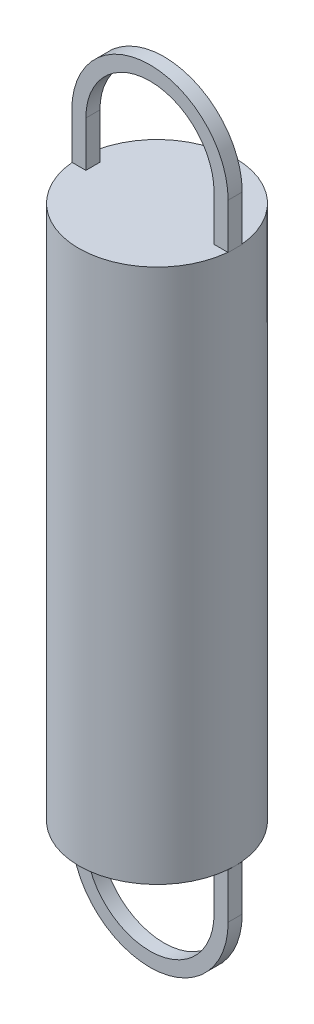
ISO-10303-21;
HEADER;
FILE_DESCRIPTION(('STEP AP214'),'2;1');
FILE_NAME('part.step','',(''),(''),'','','');
FILE_SCHEMA(('AUTOMOTIVE_DESIGN { 1 0 10303 214 1 1 1 1 }'));
ENDSEC;
DATA;
#1=APPLICATION_CONTEXT('core data for automotive mechanical design processes');
#2=APPLICATION_PROTOCOL_DEFINITION('international standard','automotive_design',2000,#1);
#3=PRODUCT_CONTEXT('',#1,'mechanical');
#4=PRODUCT('Part','Part','',(#3));
#5=PRODUCT_RELATED_PRODUCT_CATEGORY('part','',(#4));
#6=PRODUCT_DEFINITION_FORMATION('','',#4);
#7=PRODUCT_DEFINITION_CONTEXT('part definition',#1,'design');
#8=PRODUCT_DEFINITION('design','',#6,#7);
#9=PRODUCT_DEFINITION_SHAPE('','',#8);
#10=(LENGTH_UNIT() NAMED_UNIT(*) SI_UNIT(.MILLI.,.METRE.));
#11=(NAMED_UNIT(*) PLANE_ANGLE_UNIT() SI_UNIT($,.RADIAN.));
#12=(NAMED_UNIT(*) SI_UNIT($,.STERADIAN.) SOLID_ANGLE_UNIT());
#13=UNCERTAINTY_MEASURE_WITH_UNIT(LENGTH_MEASURE(1.E-05),#10,'distance_accuracy_value','');
#14=(GEOMETRIC_REPRESENTATION_CONTEXT(3) GLOBAL_UNCERTAINTY_ASSIGNED_CONTEXT((#13)) GLOBAL_UNIT_ASSIGNED_CONTEXT((#10,
#11,#12)) REPRESENTATION_CONTEXT('',''));
#15=CARTESIAN_POINT('',(0.,0.,0.));
#16=DIRECTION('',(0.,0.,1.));
#17=DIRECTION('',(1.,0.,0.));
#18=AXIS2_PLACEMENT_3D('',#15,#16,#17);
#19=CARTESIAN_POINT('',(0.,8.55,0.));
#20=DIRECTION('',(0.,-1.,0.));
#21=DIRECTION('',(0.,0.,-1.));
#22=AXIS2_PLACEMENT_3D('',#19,#20,#21);
#23=PLANE('',#22);
#24=CARTESIAN_POINT('',(0.,8.55,0.));
#25=DIRECTION('',(0.,1.,0.));
#26=DIRECTION('',(0.,0.,1.));
#27=AXIS2_PLACEMENT_3D('',#24,#25,#26);
#28=CIRCLE('',#27,2.49999999999999);
#29=CARTESIAN_POINT('',(-2.48985441341456,8.55,0.225));
#30=VERTEX_POINT('',#29);
#31=CARTESIAN_POINT('',(2.48985441341455,8.55,0.225));
#32=VERTEX_POINT('',#31);
#33=EDGE_CURVE('E326',#30,#32,#28,.T.);
#34=ORIENTED_EDGE('',*,*,#33,.T.);
#35=DIRECTION('',(1.,0.,0.));
#36=VECTOR('',#35,1.);
#37=CARTESIAN_POINT('',(0.,8.55,0.225));
#38=LINE('',#37,#36);
#39=CARTESIAN_POINT('',(2.04999999999999,8.55,0.225));
#40=VERTEX_POINT('',#39);
#41=EDGE_CURVE('E49',#40,#32,#38,.T.);
#42=ORIENTED_EDGE('',*,*,#41,.F.);
#43=DIRECTION('',(0.,0.,-1.));
#44=VECTOR('',#43,1.);
#45=CARTESIAN_POINT('',(2.04999999999999,8.55,0.225));
#46=LINE('',#45,#44);
#47=CARTESIAN_POINT('',(2.04999999999999,8.55,-0.225));
#48=VERTEX_POINT('',#47);
#49=EDGE_CURVE('E54',#40,#48,#46,.T.);
#50=ORIENTED_EDGE('',*,*,#49,.T.);
#51=DIRECTION('',(1.,0.,0.));
#52=VECTOR('',#51,1.);
#53=CARTESIAN_POINT('',(0.,8.55,-0.225));
#54=LINE('',#53,#52);
#55=CARTESIAN_POINT('',(2.48985441341455,8.55,-0.225));
#56=VERTEX_POINT('',#55);
#57=EDGE_CURVE('E213',#48,#56,#54,.T.);
#58=ORIENTED_EDGE('',*,*,#57,.T.);
#59=CARTESIAN_POINT('',(-2.48985441341456,8.55,-0.225));
#60=VERTEX_POINT('',#59);
#61=EDGE_CURVE('E430',#56,#60,#28,.T.);
#62=ORIENTED_EDGE('',*,*,#61,.T.);
#63=CARTESIAN_POINT('',(-2.05,8.55,-0.225));
#64=VERTEX_POINT('',#63);
#65=EDGE_CURVE('E211',#60,#64,#54,.T.);
#66=ORIENTED_EDGE('',*,*,#65,.T.);
#67=DIRECTION('',(0.,0.,-1.));
#68=VECTOR('',#67,1.);
#69=CARTESIAN_POINT('',(-2.05,8.55,0.225));
#70=LINE('',#69,#68);
#71=CARTESIAN_POINT('',(-2.05,8.55,0.225));
#72=VERTEX_POINT('',#71);
#73=EDGE_CURVE('E242',#72,#64,#70,.T.);
#74=ORIENTED_EDGE('',*,*,#73,.F.);
#75=EDGE_CURVE('E207',#30,#72,#38,.T.);
#76=ORIENTED_EDGE('',*,*,#75,.F.);
#77=EDGE_LOOP('',(#34,#42,#50,#58,#62,#66,#74,#76));
#78=FACE_BOUND('',#77,.T.);
#79=ADVANCED_FACE('F35',(#78),#23,.F.);
#80=CARTESIAN_POINT('',(0.,8.55,0.));
#81=DIRECTION('',(0.,1.,0.));
#82=DIRECTION('',(0.,0.,1.));
#83=AXIS2_PLACEMENT_3D('',#80,#81,#82);
#84=CYLINDRICAL_SURFACE('',#83,2.49999999999999);
#85=CARTESIAN_POINT('',(2.49999999999998,8.55,0.));
#86=VERTEX_POINT('',#85);
#87=EDGE_CURVE('E328',#32,#86,#28,.T.);
#88=ORIENTED_EDGE('',*,*,#87,.F.);
#89=ORIENTED_EDGE('',*,*,#33,.F.);
#90=CARTESIAN_POINT('',(-2.49999999999999,8.55,0.));
#91=VERTEX_POINT('',#90);
#92=EDGE_CURVE('E413',#91,#30,#28,.T.);
#93=ORIENTED_EDGE('',*,*,#92,.F.);
#94=EDGE_CURVE('E434',#60,#91,#28,.T.);
#95=ORIENTED_EDGE('',*,*,#94,.F.);
#96=ORIENTED_EDGE('',*,*,#61,.F.);
#97=EDGE_CURVE('E330',#86,#56,#28,.T.);
#98=ORIENTED_EDGE('',*,*,#97,.F.);
#99=EDGE_LOOP('',(#88,#89,#93,#95,#96,#98));
#100=FACE_BOUND('',#99,.T.);
#101=CARTESIAN_POINT('',(0.,-8.55,0.));
#102=DIRECTION('',(0.,1.,0.));
#103=DIRECTION('',(0.,0.,1.));
#104=AXIS2_PLACEMENT_3D('',#101,#102,#103);
#105=CIRCLE('',#104,2.49999999999998);
#106=CARTESIAN_POINT('',(2.48985441341455,-8.55,0.225));
#107=VERTEX_POINT('',#106);
#108=CARTESIAN_POINT('',(2.49999999999998,-8.55,0.));
#109=VERTEX_POINT('',#108);
#110=EDGE_CURVE('E323',#107,#109,#105,.T.);
#111=ORIENTED_EDGE('',*,*,#110,.T.);
#112=CARTESIAN_POINT('',(2.48985441341455,-8.55,-0.225));
#113=VERTEX_POINT('',#112);
#114=EDGE_CURVE('E327',#109,#113,#105,.T.);
#115=ORIENTED_EDGE('',*,*,#114,.T.);
#116=CARTESIAN_POINT('',(-2.48985441341455,-8.55,-0.225));
#117=VERTEX_POINT('',#116);
#118=EDGE_CURVE('E337',#113,#117,#105,.T.);
#119=ORIENTED_EDGE('',*,*,#118,.T.);
#120=CARTESIAN_POINT('',(-2.49999999999999,-8.55,0.));
#121=VERTEX_POINT('',#120);
#122=EDGE_CURVE('E348',#117,#121,#105,.T.);
#123=ORIENTED_EDGE('',*,*,#122,.T.);
#124=CARTESIAN_POINT('',(-2.48985441341455,-8.55,0.225));
#125=VERTEX_POINT('',#124);
#126=EDGE_CURVE('E349',#121,#125,#105,.T.);
#127=ORIENTED_EDGE('',*,*,#126,.T.);
#128=EDGE_CURVE('E322',#125,#107,#105,.T.);
#129=ORIENTED_EDGE('',*,*,#128,.T.);
#130=EDGE_LOOP('',(#111,#115,#119,#123,#127,#129));
#131=FACE_BOUND('',#130,.T.);
#132=ADVANCED_FACE('F345',(#100,#131),#84,.T.);
#133=CARTESIAN_POINT('',(0.,-8.55,0.));
#134=DIRECTION('',(0.,-1.,0.));
#135=DIRECTION('',(0.,0.,-1.));
#136=AXIS2_PLACEMENT_3D('',#133,#134,#135);
#137=PLANE('',#136);
#138=DIRECTION('',(1.,0.,0.));
#139=VECTOR('',#138,1.);
#140=CARTESIAN_POINT('',(0.,-8.55,0.225));
#141=LINE('',#140,#139);
#142=CARTESIAN_POINT('',(2.04999999999998,-8.55,0.225));
#143=VERTEX_POINT('',#142);
#144=EDGE_CURVE('E268',#143,#107,#141,.T.);
#145=ORIENTED_EDGE('',*,*,#144,.T.);
#146=ORIENTED_EDGE('',*,*,#128,.F.);
#147=DIRECTION('',(-1.,0.,0.));
#148=VECTOR('',#147,1.);
#149=CARTESIAN_POINT('',(0.,-8.55,0.225));
#150=LINE('',#149,#148);
#151=CARTESIAN_POINT('',(-2.04999999999999,-8.55,0.225));
#152=VERTEX_POINT('',#151);
#153=EDGE_CURVE('E11',#152,#125,#150,.T.);
#154=ORIENTED_EDGE('',*,*,#153,.F.);
#155=DIRECTION('',(0.,0.,-1.));
#156=VECTOR('',#155,1.);
#157=CARTESIAN_POINT('',(-2.04999999999999,-8.55,0.225));
#158=LINE('',#157,#156);
#159=CARTESIAN_POINT('',(-2.04999999999999,-8.55,-0.225));
#160=VERTEX_POINT('',#159);
#161=EDGE_CURVE('E302',#152,#160,#158,.T.);
#162=ORIENTED_EDGE('',*,*,#161,.T.);
#163=DIRECTION('',(-1.,0.,0.));
#164=VECTOR('',#163,1.);
#165=CARTESIAN_POINT('',(0.,-8.55,-0.225));
#166=LINE('',#165,#164);
#167=EDGE_CURVE('E42',#160,#117,#166,.T.);
#168=ORIENTED_EDGE('',*,*,#167,.T.);
#169=ORIENTED_EDGE('',*,*,#118,.F.);
#170=DIRECTION('',(1.,0.,0.));
#171=VECTOR('',#170,1.);
#172=CARTESIAN_POINT('',(0.,-8.55,-0.225));
#173=LINE('',#172,#171);
#174=CARTESIAN_POINT('',(2.04999999999998,-8.55,-0.225));
#175=VERTEX_POINT('',#174);
#176=EDGE_CURVE('E288',#175,#113,#173,.T.);
#177=ORIENTED_EDGE('',*,*,#176,.F.);
#178=DIRECTION('',(0.,0.,-1.));
#179=VECTOR('',#178,1.);
#180=CARTESIAN_POINT('',(2.04999999999998,-8.55,0.225));
#181=LINE('',#180,#179);
#182=EDGE_CURVE('E310',#143,#175,#181,.T.);
#183=ORIENTED_EDGE('',*,*,#182,.F.);
#184=EDGE_LOOP('',(#145,#146,#154,#162,#168,#169,#177,#183));
#185=FACE_BOUND('',#184,.T.);
#186=ADVANCED_FACE('F335',(#185),#137,.T.);
#187=CARTESIAN_POINT('',(0.,-8.55,0.225));
#188=DIRECTION('',(0.,1.,0.));
#189=DIRECTION('',(0.,0.,1.));
#190=AXIS2_PLACEMENT_3D('',#187,#188,#189);
#191=PLANE('',#190);
#192=ORIENTED_EDGE('',*,*,#110,.F.);
#193=CARTESIAN_POINT('',(2.49999999999998,-8.55,0.225));
#194=VERTEX_POINT('',#193);
#195=EDGE_CURVE('E267',#107,#194,#141,.T.);
#196=ORIENTED_EDGE('',*,*,#195,.T.);
#197=DIRECTION('',(0.,0.,-1.));
#198=VECTOR('',#197,1.);
#199=CARTESIAN_POINT('',(2.49999999999998,-8.55,0.225));
#200=LINE('',#199,#198);
#201=EDGE_CURVE('E314',#194,#109,#200,.T.);
#202=ORIENTED_EDGE('',*,*,#201,.T.);
#203=EDGE_LOOP('',(#192,#196,#202));
#204=FACE_BOUND('',#203,.T.);
#205=ADVANCED_FACE('F392',(#204),#191,.T.);
#206=ORIENTED_EDGE('',*,*,#122,.F.);
#207=CARTESIAN_POINT('',(-2.49999999999999,-8.55,-0.225));
#208=VERTEX_POINT('',#207);
#209=EDGE_CURVE('E262',#208,#117,#173,.T.);
#210=ORIENTED_EDGE('',*,*,#209,.F.);
#211=DIRECTION('',(0.,0.,-1.));
#212=VECTOR('',#211,1.);
#213=CARTESIAN_POINT('',(-2.49999999999999,-8.55,0.225));
#214=LINE('',#213,#212);
#215=EDGE_CURVE('E303',#121,#208,#214,.T.);
#216=ORIENTED_EDGE('',*,*,#215,.F.);
#217=EDGE_LOOP('',(#206,#210,#216));
#218=FACE_BOUND('',#217,.T.);
#219=ADVANCED_FACE('F394',(#218),#191,.T.);
#220=CARTESIAN_POINT('',(-2.49999999999998,0.,0.225));
#221=DIRECTION('',(-1.,0.,0.));
#222=DIRECTION('',(0.,-1.,0.));
#223=AXIS2_PLACEMENT_3D('',#220,#221,#222);
#224=PLANE('',#223);
#225=DIRECTION('',(0.,1.,0.));
#226=VECTOR('',#225,1.);
#227=CARTESIAN_POINT('',(-2.49999999999998,0.,-0.225));
#228=LINE('',#227,#226);
#229=CARTESIAN_POINT('',(-2.49999999999999,-10.,-0.225));
#230=VERTEX_POINT('',#229);
#231=EDGE_CURVE('E192',#230,#208,#228,.T.);
#232=ORIENTED_EDGE('',*,*,#231,.F.);
#233=DIRECTION('',(0.,0.,-1.));
#234=VECTOR('',#233,1.);
#235=CARTESIAN_POINT('',(-2.49999999999999,-10.,0.225));
#236=LINE('',#235,#234);
#237=CARTESIAN_POINT('',(-2.49999999999999,-10.,0.225));
#238=VERTEX_POINT('',#237);
#239=EDGE_CURVE('E320',#238,#230,#236,.T.);
#240=ORIENTED_EDGE('',*,*,#239,.F.);
#241=DIRECTION('',(0.,1.,0.));
#242=VECTOR('',#241,1.);
#243=CARTESIAN_POINT('',(-2.49999999999998,0.,0.225));
#244=LINE('',#243,#242);
#245=CARTESIAN_POINT('',(-2.49999999999999,-8.55,0.225));
#246=VERTEX_POINT('',#245);
#247=EDGE_CURVE('E258',#238,#246,#244,.T.);
#248=ORIENTED_EDGE('',*,*,#247,.T.);
#249=EDGE_CURVE('E299',#246,#121,#214,.T.);
#250=ORIENTED_EDGE('',*,*,#249,.T.);
#251=ORIENTED_EDGE('',*,*,#215,.T.);
#252=EDGE_LOOP('',(#232,#240,#248,#250,#251));
#253=FACE_BOUND('',#252,.T.);
#254=ADVANCED_FACE('F387',(#253),#224,.T.);
#255=CARTESIAN_POINT('',(0.,-10.,0.225));
#256=DIRECTION('',(0.,0.,-1.));
#257=DIRECTION('',(-1.,0.,0.));
#258=AXIS2_PLACEMENT_3D('',#255,#256,#257);
#259=CYLINDRICAL_SURFACE('',#258,2.49999999999999);
#260=CARTESIAN_POINT('',(0.,-10.,-0.225));
#261=DIRECTION('',(0.,0.,1.));
#262=DIRECTION('',(1.,0.,0.));
#263=AXIS2_PLACEMENT_3D('',#260,#261,#262);
#264=CIRCLE('',#263,2.49999999999999);
#265=CARTESIAN_POINT('',(2.49999999999999,-10.,-0.225));
#266=VERTEX_POINT('',#265);
#267=EDGE_CURVE('E282',#230,#266,#264,.T.);
#268=ORIENTED_EDGE('',*,*,#267,.T.);
#269=DIRECTION('',(0.,0.,-1.));
#270=VECTOR('',#269,1.);
#271=CARTESIAN_POINT('',(2.49999999999999,-10.,0.225));
#272=LINE('',#271,#270);
#273=CARTESIAN_POINT('',(2.49999999999999,-10.,0.225));
#274=VERTEX_POINT('',#273);
#275=EDGE_CURVE('E317',#274,#266,#272,.T.);
#276=ORIENTED_EDGE('',*,*,#275,.F.);
#277=CARTESIAN_POINT('',(0.,-10.,0.225));
#278=DIRECTION('',(0.,0.,1.));
#279=DIRECTION('',(1.,0.,0.));
#280=AXIS2_PLACEMENT_3D('',#277,#278,#279);
#281=CIRCLE('',#280,2.49999999999999);
#282=EDGE_CURVE('E261',#238,#274,#281,.T.);
#283=ORIENTED_EDGE('',*,*,#282,.F.);
#284=ORIENTED_EDGE('',*,*,#239,.T.);
#285=EDGE_LOOP('',(#268,#276,#283,#284));
#286=FACE_BOUND('',#285,.T.);
#287=ADVANCED_FACE('F383',(#286),#259,.T.);
#288=CARTESIAN_POINT('',(2.49999999999993,0.,0.225));
#289=DIRECTION('',(-1.,0.,0.));
#290=DIRECTION('',(0.,-1.,0.));
#291=AXIS2_PLACEMENT_3D('',#288,#289,#290);
#292=PLANE('',#291);
#293=DIRECTION('',(0.,1.,0.));
#294=VECTOR('',#293,1.);
#295=CARTESIAN_POINT('',(2.49999999999993,0.,-0.225));
#296=LINE('',#295,#294);
#297=CARTESIAN_POINT('',(2.49999999999998,-8.55,-0.225));
#298=VERTEX_POINT('',#297);
#299=EDGE_CURVE('E284',#266,#298,#296,.T.);
#300=ORIENTED_EDGE('',*,*,#299,.T.);
#301=EDGE_CURVE('E313',#109,#298,#200,.T.);
#302=ORIENTED_EDGE('',*,*,#301,.F.);
#303=ORIENTED_EDGE('',*,*,#201,.F.);
#304=DIRECTION('',(0.,1.,0.));
#305=VECTOR('',#304,1.);
#306=CARTESIAN_POINT('',(2.49999999999993,0.,0.225));
#307=LINE('',#306,#305);
#308=EDGE_CURVE('E264',#274,#194,#307,.T.);
#309=ORIENTED_EDGE('',*,*,#308,.F.);
#310=ORIENTED_EDGE('',*,*,#275,.T.);
#311=EDGE_LOOP('',(#300,#302,#303,#309,#310));
#312=FACE_BOUND('',#311,.T.);
#313=ADVANCED_FACE('F377',(#312),#292,.F.);
#314=ORIENTED_EDGE('',*,*,#114,.F.);
#315=ORIENTED_EDGE('',*,*,#301,.T.);
#316=EDGE_CURVE('E287',#113,#298,#173,.T.);
#317=ORIENTED_EDGE('',*,*,#316,.F.);
#318=EDGE_LOOP('',(#314,#315,#317));
#319=FACE_BOUND('',#318,.T.);
#320=ADVANCED_FACE('F401',(#319),#191,.T.);
#321=CARTESIAN_POINT('',(2.04999999999998,0.,0.225));
#322=DIRECTION('',(-1.,0.,0.));
#323=DIRECTION('',(0.,0.,1.));
#324=AXIS2_PLACEMENT_3D('',#321,#322,#323);
#325=PLANE('',#324);
#326=DIRECTION('',(0.,1.,0.));
#327=VECTOR('',#326,1.);
#328=CARTESIAN_POINT('',(2.04999999999998,0.,-0.225));
#329=LINE('',#328,#327);
#330=CARTESIAN_POINT('',(2.04999999999998,-10.,-0.225));
#331=VERTEX_POINT('',#330);
#332=EDGE_CURVE('E291',#331,#175,#329,.T.);
#333=ORIENTED_EDGE('',*,*,#332,.F.);
#334=DIRECTION('',(0.,0.,-1.));
#335=VECTOR('',#334,1.);
#336=CARTESIAN_POINT('',(2.04999999999998,-10.,0.225));
#337=LINE('',#336,#335);
#338=CARTESIAN_POINT('',(2.04999999999998,-10.,0.225));
#339=VERTEX_POINT('',#338);
#340=EDGE_CURVE('E308',#339,#331,#337,.T.);
#341=ORIENTED_EDGE('',*,*,#340,.F.);
#342=DIRECTION('',(0.,1.,0.));
#343=VECTOR('',#342,1.);
#344=CARTESIAN_POINT('',(2.04999999999998,0.,0.225));
#345=LINE('',#344,#343);
#346=EDGE_CURVE('E271',#339,#143,#345,.T.);
#347=ORIENTED_EDGE('',*,*,#346,.T.);
#348=ORIENTED_EDGE('',*,*,#182,.T.);
#349=EDGE_LOOP('',(#333,#341,#347,#348));
#350=FACE_BOUND('',#349,.T.);
#351=ADVANCED_FACE('F361',(#350),#325,.T.);
#352=CARTESIAN_POINT('',(0.,-10.,0.225));
#353=DIRECTION('',(0.,0.,-1.));
#354=DIRECTION('',(-1.,0.,0.));
#355=AXIS2_PLACEMENT_3D('',#352,#353,#354);
#356=CYLINDRICAL_SURFACE('',#355,2.04999999999999);
#357=CARTESIAN_POINT('',(0.,-10.,-0.225));
#358=DIRECTION('',(0.,0.,1.));
#359=DIRECTION('',(1.,0.,0.));
#360=AXIS2_PLACEMENT_3D('',#357,#358,#359);
#361=CIRCLE('',#360,2.04999999999999);
#362=CARTESIAN_POINT('',(-2.04999999999999,-10.,-0.225));
#363=VERTEX_POINT('',#362);
#364=EDGE_CURVE('E293',#363,#331,#361,.T.);
#365=ORIENTED_EDGE('',*,*,#364,.F.);
#366=DIRECTION('',(0.,0.,-1.));
#367=VECTOR('',#366,1.);
#368=CARTESIAN_POINT('',(-2.04999999999999,-10.,0.225));
#369=LINE('',#368,#367);
#370=CARTESIAN_POINT('',(-2.04999999999999,-10.,0.225));
#371=VERTEX_POINT('',#370);
#372=EDGE_CURVE('E306',#371,#363,#369,.T.);
#373=ORIENTED_EDGE('',*,*,#372,.F.);
#374=CARTESIAN_POINT('',(0.,-10.,0.225));
#375=DIRECTION('',(0.,0.,1.));
#376=DIRECTION('',(1.,0.,0.));
#377=AXIS2_PLACEMENT_3D('',#374,#375,#376);
#378=CIRCLE('',#377,2.04999999999999);
#379=EDGE_CURVE('E275',#371,#339,#378,.T.);
#380=ORIENTED_EDGE('',*,*,#379,.T.);
#381=ORIENTED_EDGE('',*,*,#340,.T.);
#382=EDGE_LOOP('',(#365,#373,#380,#381));
#383=FACE_BOUND('',#382,.T.);
#384=ADVANCED_FACE('F364',(#383),#356,.F.);
#385=CARTESIAN_POINT('',(-2.04999999999999,0.,0.225));
#386=DIRECTION('',(-1.,0.,0.));
#387=DIRECTION('',(0.,0.,1.));
#388=AXIS2_PLACEMENT_3D('',#385,#386,#387);
#389=PLANE('',#388);
#390=DIRECTION('',(0.,1.,0.));
#391=VECTOR('',#390,1.);
#392=CARTESIAN_POINT('',(-2.04999999999999,0.,-0.225));
#393=LINE('',#392,#391);
#394=EDGE_CURVE('E296',#363,#160,#393,.T.);
#395=ORIENTED_EDGE('',*,*,#394,.T.);
#396=ORIENTED_EDGE('',*,*,#161,.F.);
#397=DIRECTION('',(0.,1.,0.));
#398=VECTOR('',#397,1.);
#399=CARTESIAN_POINT('',(-2.04999999999999,0.,0.225));
#400=LINE('',#399,#398);
#401=EDGE_CURVE('E278',#371,#152,#400,.T.);
#402=ORIENTED_EDGE('',*,*,#401,.F.);
#403=ORIENTED_EDGE('',*,*,#372,.T.);
#404=EDGE_LOOP('',(#395,#396,#402,#403));
#405=FACE_BOUND('',#404,.T.);
#406=ADVANCED_FACE('F369',(#405),#389,.F.);
#407=ORIENTED_EDGE('',*,*,#126,.F.);
#408=ORIENTED_EDGE('',*,*,#249,.F.);
#409=EDGE_CURVE('E272',#246,#125,#141,.T.);
#410=ORIENTED_EDGE('',*,*,#409,.T.);
#411=EDGE_LOOP('',(#407,#408,#410));
#412=FACE_BOUND('',#411,.T.);
#413=ADVANCED_FACE('F396',(#412),#191,.T.);
#414=CARTESIAN_POINT('',(0.,0.,0.225));
#415=DIRECTION('',(0.,0.,1.));
#416=DIRECTION('',(1.,0.,0.));
#417=AXIS2_PLACEMENT_3D('',#414,#415,#416);
#418=PLANE('',#417);
#419=ORIENTED_EDGE('',*,*,#247,.F.);
#420=ORIENTED_EDGE('',*,*,#282,.T.);
#421=ORIENTED_EDGE('',*,*,#308,.T.);
#422=ORIENTED_EDGE('',*,*,#195,.F.);
#423=ORIENTED_EDGE('',*,*,#144,.F.);
#424=ORIENTED_EDGE('',*,*,#346,.F.);
#425=ORIENTED_EDGE('',*,*,#379,.F.);
#426=ORIENTED_EDGE('',*,*,#401,.T.);
#427=ORIENTED_EDGE('',*,*,#153,.T.);
#428=ORIENTED_EDGE('',*,*,#409,.F.);
#429=EDGE_LOOP('',(#419,#420,#421,#422,#423,#424,#425,#426,#427,#428));
#430=FACE_BOUND('',#429,.T.);
#431=ADVANCED_FACE('F357',(#430),#418,.T.);
#432=CARTESIAN_POINT('',(0.,0.,-0.225));
#433=DIRECTION('',(0.,0.,1.));
#434=DIRECTION('',(1.,0.,0.));
#435=AXIS2_PLACEMENT_3D('',#432,#433,#434);
#436=PLANE('',#435);
#437=ORIENTED_EDGE('',*,*,#231,.T.);
#438=ORIENTED_EDGE('',*,*,#209,.T.);
#439=ORIENTED_EDGE('',*,*,#167,.F.);
#440=ORIENTED_EDGE('',*,*,#394,.F.);
#441=ORIENTED_EDGE('',*,*,#364,.T.);
#442=ORIENTED_EDGE('',*,*,#332,.T.);
#443=ORIENTED_EDGE('',*,*,#176,.T.);
#444=ORIENTED_EDGE('',*,*,#316,.T.);
#445=ORIENTED_EDGE('',*,*,#299,.F.);
#446=ORIENTED_EDGE('',*,*,#267,.F.);
#447=EDGE_LOOP('',(#437,#438,#439,#440,#441,#442,#443,#444,#445,#446));
#448=FACE_BOUND('',#447,.T.);
#449=ADVANCED_FACE('F370',(#448),#436,.F.);
#450=CARTESIAN_POINT('',(0.,8.55,0.225));
#451=DIRECTION('',(0.,1.,0.));
#452=DIRECTION('',(0.,0.,1.));
#453=AXIS2_PLACEMENT_3D('',#450,#451,#452);
#454=PLANE('',#453);
#455=CARTESIAN_POINT('',(2.49999999999998,8.55,0.225));
#456=VERTEX_POINT('',#455);
#457=EDGE_CURVE('E216',#32,#456,#38,.T.);
#458=ORIENTED_EDGE('',*,*,#457,.F.);
#459=ORIENTED_EDGE('',*,*,#87,.T.);
#460=DIRECTION('',(0.,0.,-1.));
#461=VECTOR('',#460,1.);
#462=CARTESIAN_POINT('',(2.49999999999998,8.55,0.225));
#463=LINE('',#462,#461);
#464=EDGE_CURVE('E253',#456,#86,#463,.T.);
#465=ORIENTED_EDGE('',*,*,#464,.F.);
#466=EDGE_LOOP('',(#458,#459,#465));
#467=FACE_BOUND('',#466,.T.);
#468=ADVANCED_FACE('F419',(#467),#454,.F.);
#469=CARTESIAN_POINT('',(-2.49999999999999,8.55,-0.225));
#470=VERTEX_POINT('',#469);
#471=EDGE_CURVE('E208',#470,#60,#54,.T.);
#472=ORIENTED_EDGE('',*,*,#471,.T.);
#473=ORIENTED_EDGE('',*,*,#94,.T.);
#474=DIRECTION('',(0.,0.,-1.));
#475=VECTOR('',#474,1.);
#476=CARTESIAN_POINT('',(-2.49999999999999,8.55,0.225));
#477=LINE('',#476,#475);
#478=EDGE_CURVE('E244',#91,#470,#477,.T.);
#479=ORIENTED_EDGE('',*,*,#478,.T.);
#480=EDGE_LOOP('',(#472,#473,#479));
#481=FACE_BOUND('',#480,.T.);
#482=ADVANCED_FACE('F448',(#481),#454,.F.);
#483=CARTESIAN_POINT('',(-2.05,0.,0.225));
#484=DIRECTION('',(1.,0.,0.));
#485=DIRECTION('',(0.,0.,-1.));
#486=AXIS2_PLACEMENT_3D('',#483,#484,#485);
#487=PLANE('',#486);
#488=DIRECTION('',(0.,-1.,0.));
#489=VECTOR('',#488,1.);
#490=CARTESIAN_POINT('',(-2.05,0.,-0.225));
#491=LINE('',#490,#489);
#492=CARTESIAN_POINT('',(-2.05,10.,-0.225));
#493=VERTEX_POINT('',#492);
#494=EDGE_CURVE('E189',#493,#64,#491,.T.);
#495=ORIENTED_EDGE('',*,*,#494,.F.);
#496=DIRECTION('',(0.,0.,-1.));
#497=VECTOR('',#496,1.);
#498=CARTESIAN_POINT('',(-2.05,10.,0.225));
#499=LINE('',#498,#497);
#500=CARTESIAN_POINT('',(-2.05,10.,0.225));
#501=VERTEX_POINT('',#500);
#502=EDGE_CURVE('E182',#501,#493,#499,.T.);
#503=ORIENTED_EDGE('',*,*,#502,.F.);
#504=DIRECTION('',(0.,-1.,0.));
#505=VECTOR('',#504,1.);
#506=CARTESIAN_POINT('',(-2.05,0.,0.225));
#507=LINE('',#506,#505);
#508=EDGE_CURVE('E187',#501,#72,#507,.T.);
#509=ORIENTED_EDGE('',*,*,#508,.T.);
#510=ORIENTED_EDGE('',*,*,#73,.T.);
#511=EDGE_LOOP('',(#495,#503,#509,#510));
#512=FACE_BOUND('',#511,.T.);
#513=ADVANCED_FACE('F184',(#512),#487,.T.);
#514=CARTESIAN_POINT('',(0.,10.,0.225));
#515=DIRECTION('',(0.,0.,-1.));
#516=DIRECTION('',(-1.,0.,0.));
#517=AXIS2_PLACEMENT_3D('',#514,#515,#516);
#518=CYLINDRICAL_SURFACE('',#517,2.05);
#519=CARTESIAN_POINT('',(0.,10.,-0.225));
#520=DIRECTION('',(0.,0.,1.));
#521=DIRECTION('',(1.,0.,0.));
#522=AXIS2_PLACEMENT_3D('',#519,#520,#521);
#523=CIRCLE('',#522,2.05);
#524=CARTESIAN_POINT('',(2.04999999999999,10.,-0.225));
#525=VERTEX_POINT('',#524);
#526=EDGE_CURVE('E228',#493,#525,#523,.F.);
#527=ORIENTED_EDGE('',*,*,#526,.T.);
#528=DIRECTION('',(0.,0.,-1.));
#529=VECTOR('',#528,1.);
#530=CARTESIAN_POINT('',(2.04999999999999,10.,0.225));
#531=LINE('',#530,#529);
#532=CARTESIAN_POINT('',(2.04999999999999,10.,0.225));
#533=VERTEX_POINT('',#532);
#534=EDGE_CURVE('E193',#533,#525,#531,.T.);
#535=ORIENTED_EDGE('',*,*,#534,.F.);
#536=CARTESIAN_POINT('',(0.,10.,0.225));
#537=DIRECTION('',(0.,0.,1.));
#538=DIRECTION('',(1.,0.,0.));
#539=AXIS2_PLACEMENT_3D('',#536,#537,#538);
#540=CIRCLE('',#539,2.05);
#541=EDGE_CURVE('E196',#501,#533,#540,.F.);
#542=ORIENTED_EDGE('',*,*,#541,.F.);
#543=ORIENTED_EDGE('',*,*,#502,.T.);
#544=EDGE_LOOP('',(#527,#535,#542,#543));
#545=FACE_BOUND('',#544,.T.);
#546=ADVANCED_FACE('F197',(#545),#518,.F.);
#547=CARTESIAN_POINT('',(2.04999999999998,0.,0.225));
#548=DIRECTION('',(1.,0.,0.));
#549=DIRECTION('',(0.,1.,0.));
#550=AXIS2_PLACEMENT_3D('',#547,#548,#549);
#551=PLANE('',#550);
#552=DIRECTION('',(0.,-1.,0.));
#553=VECTOR('',#552,1.);
#554=CARTESIAN_POINT('',(2.04999999999998,0.,-0.225));
#555=LINE('',#554,#553);
#556=EDGE_CURVE('E230',#525,#48,#555,.T.);
#557=ORIENTED_EDGE('',*,*,#556,.T.);
#558=ORIENTED_EDGE('',*,*,#49,.F.);
#559=DIRECTION('',(0.,-1.,0.));
#560=VECTOR('',#559,1.);
#561=CARTESIAN_POINT('',(2.04999999999998,0.,0.225));
#562=LINE('',#561,#560);
#563=EDGE_CURVE('E201',#533,#40,#562,.T.);
#564=ORIENTED_EDGE('',*,*,#563,.F.);
#565=ORIENTED_EDGE('',*,*,#534,.T.);
#566=EDGE_LOOP('',(#557,#558,#564,#565));
#567=FACE_BOUND('',#566,.T.);
#568=ADVANCED_FACE('F422',(#567),#551,.F.);
#569=CARTESIAN_POINT('',(2.49999999999998,8.55,-0.225));
#570=VERTEX_POINT('',#569);
#571=EDGE_CURVE('E252',#86,#570,#463,.T.);
#572=ORIENTED_EDGE('',*,*,#571,.F.);
#573=ORIENTED_EDGE('',*,*,#97,.T.);
#574=EDGE_CURVE('E231',#56,#570,#54,.T.);
#575=ORIENTED_EDGE('',*,*,#574,.T.);
#576=EDGE_LOOP('',(#572,#573,#575));
#577=FACE_BOUND('',#576,.T.);
#578=ADVANCED_FACE('F433',(#577),#454,.F.);
#579=CARTESIAN_POINT('',(2.49999999999993,0.,0.225));
#580=DIRECTION('',(1.,0.,0.));
#581=DIRECTION('',(0.,1.,0.));
#582=AXIS2_PLACEMENT_3D('',#579,#580,#581);
#583=PLANE('',#582);
#584=DIRECTION('',(0.,-1.,0.));
#585=VECTOR('',#584,1.);
#586=CARTESIAN_POINT('',(2.49999999999993,0.,-0.225));
#587=LINE('',#586,#585);
#588=CARTESIAN_POINT('',(2.49999999999999,10.,-0.225));
#589=VERTEX_POINT('',#588);
#590=EDGE_CURVE('E233',#589,#570,#587,.T.);
#591=ORIENTED_EDGE('',*,*,#590,.F.);
#592=DIRECTION('',(0.,0.,-1.));
#593=VECTOR('',#592,1.);
#594=CARTESIAN_POINT('',(2.49999999999999,10.,0.225));
#595=LINE('',#594,#593);
#596=CARTESIAN_POINT('',(2.49999999999999,10.,0.225));
#597=VERTEX_POINT('',#596);
#598=EDGE_CURVE('E250',#597,#589,#595,.T.);
#599=ORIENTED_EDGE('',*,*,#598,.F.);
#600=DIRECTION('',(0.,-1.,0.));
#601=VECTOR('',#600,1.);
#602=CARTESIAN_POINT('',(2.49999999999993,0.,0.225));
#603=LINE('',#602,#601);
#604=EDGE_CURVE('E218',#597,#456,#603,.T.);
#605=ORIENTED_EDGE('',*,*,#604,.T.);
#606=ORIENTED_EDGE('',*,*,#464,.T.);
#607=ORIENTED_EDGE('',*,*,#571,.T.);
#608=EDGE_LOOP('',(#591,#599,#605,#606,#607));
#609=FACE_BOUND('',#608,.T.);
#610=ADVANCED_FACE('F454',(#609),#583,.T.);
#611=CARTESIAN_POINT('',(0.,10.,0.225));
#612=DIRECTION('',(0.,0.,-1.));
#613=DIRECTION('',(-1.,0.,0.));
#614=AXIS2_PLACEMENT_3D('',#611,#612,#613);
#615=CYLINDRICAL_SURFACE('',#614,2.49999999999999);
#616=CARTESIAN_POINT('',(0.,10.,-0.225));
#617=DIRECTION('',(0.,0.,1.));
#618=DIRECTION('',(1.,0.,0.));
#619=AXIS2_PLACEMENT_3D('',#616,#617,#618);
#620=CIRCLE('',#619,2.49999999999999);
#621=CARTESIAN_POINT('',(-2.5,10.,-0.225));
#622=VERTEX_POINT('',#621);
#623=EDGE_CURVE('E236',#622,#589,#620,.F.);
#624=ORIENTED_EDGE('',*,*,#623,.F.);
#625=DIRECTION('',(0.,0.,-1.));
#626=VECTOR('',#625,1.);
#627=CARTESIAN_POINT('',(-2.5,10.,0.225));
#628=LINE('',#627,#626);
#629=CARTESIAN_POINT('',(-2.5,10.,0.225));
#630=VERTEX_POINT('',#629);
#631=EDGE_CURVE('E248',#630,#622,#628,.T.);
#632=ORIENTED_EDGE('',*,*,#631,.F.);
#633=CARTESIAN_POINT('',(0.,10.,0.225));
#634=DIRECTION('',(0.,0.,1.));
#635=DIRECTION('',(1.,0.,0.));
#636=AXIS2_PLACEMENT_3D('',#633,#634,#635);
#637=CIRCLE('',#636,2.49999999999999);
#638=EDGE_CURVE('E222',#630,#597,#637,.F.);
#639=ORIENTED_EDGE('',*,*,#638,.T.);
#640=ORIENTED_EDGE('',*,*,#598,.T.);
#641=EDGE_LOOP('',(#624,#632,#639,#640));
#642=FACE_BOUND('',#641,.T.);
#643=ADVANCED_FACE('F451',(#642),#615,.T.);
#644=CARTESIAN_POINT('',(-2.49999999999997,0.,0.225));
#645=DIRECTION('',(1.,0.,0.));
#646=DIRECTION('',(0.,1.,0.));
#647=AXIS2_PLACEMENT_3D('',#644,#645,#646);
#648=PLANE('',#647);
#649=DIRECTION('',(0.,-1.,0.));
#650=VECTOR('',#649,1.);
#651=CARTESIAN_POINT('',(-2.49999999999997,0.,-0.225));
#652=LINE('',#651,#650);
#653=EDGE_CURVE('E239',#622,#470,#652,.T.);
#654=ORIENTED_EDGE('',*,*,#653,.T.);
#655=ORIENTED_EDGE('',*,*,#478,.F.);
#656=CARTESIAN_POINT('',(-2.49999999999999,8.55,0.225));
#657=VERTEX_POINT('',#656);
#658=EDGE_CURVE('E245',#657,#91,#477,.T.);
#659=ORIENTED_EDGE('',*,*,#658,.F.);
#660=DIRECTION('',(0.,-1.,0.));
#661=VECTOR('',#660,1.);
#662=CARTESIAN_POINT('',(-2.49999999999997,0.,0.225));
#663=LINE('',#662,#661);
#664=EDGE_CURVE('E225',#630,#657,#663,.T.);
#665=ORIENTED_EDGE('',*,*,#664,.F.);
#666=ORIENTED_EDGE('',*,*,#631,.T.);
#667=EDGE_LOOP('',(#654,#655,#659,#665,#666));
#668=FACE_BOUND('',#667,.T.);
#669=ADVANCED_FACE('F445',(#668),#648,.F.);
#670=ORIENTED_EDGE('',*,*,#658,.T.);
#671=ORIENTED_EDGE('',*,*,#92,.T.);
#672=EDGE_CURVE('E219',#657,#30,#38,.T.);
#673=ORIENTED_EDGE('',*,*,#672,.F.);
#674=EDGE_LOOP('',(#670,#671,#673));
#675=FACE_BOUND('',#674,.T.);
#676=ADVANCED_FACE('F440',(#675),#454,.F.);
#677=CARTESIAN_POINT('',(0.,0.,0.225));
#678=DIRECTION('',(0.,0.,1.));
#679=DIRECTION('',(1.,0.,0.));
#680=AXIS2_PLACEMENT_3D('',#677,#678,#679);
#681=PLANE('',#680);
#682=ORIENTED_EDGE('',*,*,#508,.F.);
#683=ORIENTED_EDGE('',*,*,#541,.T.);
#684=ORIENTED_EDGE('',*,*,#563,.T.);
#685=ORIENTED_EDGE('',*,*,#41,.T.);
#686=ORIENTED_EDGE('',*,*,#457,.T.);
#687=ORIENTED_EDGE('',*,*,#604,.F.);
#688=ORIENTED_EDGE('',*,*,#638,.F.);
#689=ORIENTED_EDGE('',*,*,#664,.T.);
#690=ORIENTED_EDGE('',*,*,#672,.T.);
#691=ORIENTED_EDGE('',*,*,#75,.T.);
#692=EDGE_LOOP('',(#682,#683,#684,#685,#686,#687,#688,#689,#690,#691));
#693=FACE_BOUND('',#692,.T.);
#694=ADVANCED_FACE('F204',(#693),#681,.T.);
#695=CARTESIAN_POINT('',(0.,0.,-0.225));
#696=DIRECTION('',(0.,0.,1.));
#697=DIRECTION('',(1.,0.,0.));
#698=AXIS2_PLACEMENT_3D('',#695,#696,#697);
#699=PLANE('',#698);
#700=ORIENTED_EDGE('',*,*,#494,.T.);
#701=ORIENTED_EDGE('',*,*,#65,.F.);
#702=ORIENTED_EDGE('',*,*,#471,.F.);
#703=ORIENTED_EDGE('',*,*,#653,.F.);
#704=ORIENTED_EDGE('',*,*,#623,.T.);
#705=ORIENTED_EDGE('',*,*,#590,.T.);
#706=ORIENTED_EDGE('',*,*,#574,.F.);
#707=ORIENTED_EDGE('',*,*,#57,.F.);
#708=ORIENTED_EDGE('',*,*,#556,.F.);
#709=ORIENTED_EDGE('',*,*,#526,.F.);
#710=EDGE_LOOP('',(#700,#701,#702,#703,#704,#705,#706,#707,#708,#709));
#711=FACE_BOUND('',#710,.T.);
#712=ADVANCED_FACE('F427',(#711),#699,.F.);
#713=CLOSED_SHELL('',(#79,#132,#186,#205,#219,#254,#287,#313,#320,#351,#384,#406,#413,#431,#449,
#468,#482,#513,#546,#568,#578,#610,#643,#669,#676,#694,#712));
#714=MANIFOLD_SOLID_BREP('B2',#713);
#715=ADVANCED_BREP_SHAPE_REPRESENTATION('',(#18,#714),#14);
#716=SHAPE_DEFINITION_REPRESENTATION(#9,#715);
ENDSEC;
END-ISO-10303-21;
